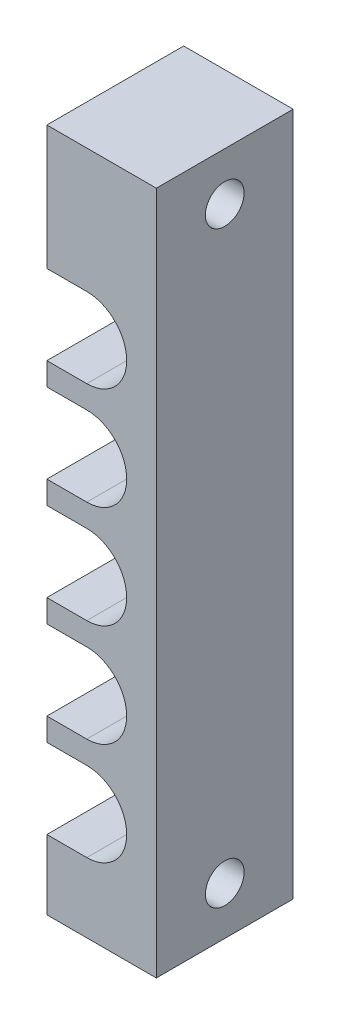
ISO-10303-21;
HEADER;
FILE_DESCRIPTION(('STEP AP214'),'2;1');
FILE_NAME('part.step','',(''),(''),'','','');
FILE_SCHEMA(('AUTOMOTIVE_DESIGN { 1 0 10303 214 1 1 1 1 }'));
ENDSEC;
DATA;
#1=APPLICATION_CONTEXT('core data for automotive mechanical design processes');
#2=APPLICATION_PROTOCOL_DEFINITION('international standard','automotive_design',2000,#1);
#3=PRODUCT_CONTEXT('',#1,'mechanical');
#4=PRODUCT('Part','Part','',(#3));
#5=PRODUCT_RELATED_PRODUCT_CATEGORY('part','',(#4));
#6=PRODUCT_DEFINITION_FORMATION('','',#4);
#7=PRODUCT_DEFINITION_CONTEXT('part definition',#1,'design');
#8=PRODUCT_DEFINITION('design','',#6,#7);
#9=PRODUCT_DEFINITION_SHAPE('','',#8);
#10=(LENGTH_UNIT() NAMED_UNIT(*) SI_UNIT(.MILLI.,.METRE.));
#11=(NAMED_UNIT(*) PLANE_ANGLE_UNIT() SI_UNIT($,.RADIAN.));
#12=(NAMED_UNIT(*) SI_UNIT($,.STERADIAN.) SOLID_ANGLE_UNIT());
#13=UNCERTAINTY_MEASURE_WITH_UNIT(LENGTH_MEASURE(1.E-05),#10,'distance_accuracy_value','');
#14=(GEOMETRIC_REPRESENTATION_CONTEXT(3) GLOBAL_UNCERTAINTY_ASSIGNED_CONTEXT((#13)) GLOBAL_UNIT_ASSIGNED_CONTEXT((#10,
#11,#12)) REPRESENTATION_CONTEXT('',''));
#15=CARTESIAN_POINT('',(0.,0.,0.));
#16=DIRECTION('',(0.,0.,1.));
#17=DIRECTION('',(1.,0.,0.));
#18=AXIS2_PLACEMENT_3D('',#15,#16,#17);
#19=CARTESIAN_POINT('',(-40.8,2.4,-69.6));
#20=DIRECTION('',(0.,0.,1.));
#21=DIRECTION('',(1.,0.,0.));
#22=AXIS2_PLACEMENT_3D('',#19,#20,#21);
#23=PLANE('',#22);
#24=DIRECTION('',(1.,0.,0.));
#25=VECTOR('',#24,1.);
#26=CARTESIAN_POINT('',(-40.8,62.4,-69.6));
#27=LINE('',#26,#25);
#28=CARTESIAN_POINT('',(-31.2,62.4,-69.6));
#29=VERTEX_POINT('',#28);
#30=CARTESIAN_POINT('',(-21.6,62.4,-69.6));
#31=VERTEX_POINT('',#30);
#32=EDGE_CURVE('E206',#29,#31,#27,.T.);
#33=ORIENTED_EDGE('',*,*,#32,.F.);
#34=DIRECTION('',(0.,1.,0.));
#35=VECTOR('',#34,1.);
#36=CARTESIAN_POINT('',(-31.1999999999995,71.6478124814453,-69.6000000000001));
#37=LINE('',#36,#35);
#38=CARTESIAN_POINT('',(-31.1999999999995,51.5,-69.6000000000001));
#39=VERTEX_POINT('',#38);
#40=EDGE_CURVE('E218',#39,#29,#37,.T.);
#41=ORIENTED_EDGE('',*,*,#40,.F.);
#42=DIRECTION('',(-1.,0.,0.));
#43=VECTOR('',#42,1.);
#44=CARTESIAN_POINT('',(-40.8,51.5,-69.6));
#45=LINE('',#44,#43);
#46=CARTESIAN_POINT('',(-27.7,51.5,-69.6));
#47=VERTEX_POINT('',#46);
#48=EDGE_CURVE('E263',#47,#39,#45,.T.);
#49=ORIENTED_EDGE('',*,*,#48,.F.);
#50=CARTESIAN_POINT('',(-27.7,48.,-69.6));
#51=DIRECTION('',(0.,0.,1.));
#52=DIRECTION('',(1.,0.,0.));
#53=AXIS2_PLACEMENT_3D('',#50,#51,#52);
#54=CIRCLE('',#53,3.5);
#55=CARTESIAN_POINT('',(-27.7,44.5,-69.6));
#56=VERTEX_POINT('',#55);
#57=EDGE_CURVE('E261',#56,#47,#54,.T.);
#58=ORIENTED_EDGE('',*,*,#57,.F.);
#59=DIRECTION('',(1.,0.,0.));
#60=VECTOR('',#59,1.);
#61=CARTESIAN_POINT('',(-40.8,44.5,-69.6));
#62=LINE('',#61,#60);
#63=CARTESIAN_POINT('',(-31.1999999999995,44.5,-69.6));
#64=VERTEX_POINT('',#63);
#65=EDGE_CURVE('E255',#64,#56,#62,.T.);
#66=ORIENTED_EDGE('',*,*,#65,.F.);
#67=CARTESIAN_POINT('',(-31.1999999999995,42.5,-69.6000000000001));
#68=VERTEX_POINT('',#67);
#69=EDGE_CURVE('E373',#68,#64,#37,.T.);
#70=ORIENTED_EDGE('',*,*,#69,.F.);
#71=DIRECTION('',(-1.,0.,0.));
#72=VECTOR('',#71,1.);
#73=CARTESIAN_POINT('',(-40.8,42.5,-69.6));
#74=LINE('',#73,#72);
#75=CARTESIAN_POINT('',(-27.7,42.5,-69.6));
#76=VERTEX_POINT('',#75);
#77=EDGE_CURVE('E327',#76,#68,#74,.T.);
#78=ORIENTED_EDGE('',*,*,#77,.F.);
#79=CARTESIAN_POINT('',(-27.7,39.,-69.6));
#80=DIRECTION('',(0.,0.,1.));
#81=DIRECTION('',(1.,0.,0.));
#82=AXIS2_PLACEMENT_3D('',#79,#80,#81);
#83=CIRCLE('',#82,3.50000000000001);
#84=CARTESIAN_POINT('',(-27.7,35.5,-69.6));
#85=VERTEX_POINT('',#84);
#86=EDGE_CURVE('E325',#85,#76,#83,.T.);
#87=ORIENTED_EDGE('',*,*,#86,.F.);
#88=DIRECTION('',(1.,0.,0.));
#89=VECTOR('',#88,1.);
#90=CARTESIAN_POINT('',(-40.8,35.5,-69.6));
#91=LINE('',#90,#89);
#92=CARTESIAN_POINT('',(-31.1999999999995,35.5,-69.6000000000001));
#93=VERTEX_POINT('',#92);
#94=EDGE_CURVE('E319',#93,#85,#91,.T.);
#95=ORIENTED_EDGE('',*,*,#94,.F.);
#96=CARTESIAN_POINT('',(-31.1999999999995,33.5,-69.6000000000001));
#97=VERTEX_POINT('',#96);
#98=EDGE_CURVE('E432',#97,#93,#37,.T.);
#99=ORIENTED_EDGE('',*,*,#98,.F.);
#100=DIRECTION('',(-1.,0.,0.));
#101=VECTOR('',#100,1.);
#102=CARTESIAN_POINT('',(-40.8,33.5,-69.6));
#103=LINE('',#102,#101);
#104=CARTESIAN_POINT('',(-27.7,33.5,-69.6));
#105=VERTEX_POINT('',#104);
#106=EDGE_CURVE('E286',#105,#97,#103,.T.);
#107=ORIENTED_EDGE('',*,*,#106,.F.);
#108=CARTESIAN_POINT('',(-27.7,30.,-69.6));
#109=DIRECTION('',(0.,0.,1.));
#110=DIRECTION('',(1.,0.,0.));
#111=AXIS2_PLACEMENT_3D('',#108,#109,#110);
#112=CIRCLE('',#111,3.5);
#113=CARTESIAN_POINT('',(-27.7,26.5,-69.6));
#114=VERTEX_POINT('',#113);
#115=EDGE_CURVE('E284',#114,#105,#112,.T.);
#116=ORIENTED_EDGE('',*,*,#115,.F.);
#117=DIRECTION('',(1.,0.,0.));
#118=VECTOR('',#117,1.);
#119=CARTESIAN_POINT('',(-40.8,26.5,-69.6));
#120=LINE('',#119,#118);
#121=CARTESIAN_POINT('',(-31.1999999999995,26.5,-69.6));
#122=VERTEX_POINT('',#121);
#123=EDGE_CURVE('E278',#122,#114,#120,.T.);
#124=ORIENTED_EDGE('',*,*,#123,.F.);
#125=CARTESIAN_POINT('',(-31.1999999999995,24.5,-69.6000000000001));
#126=VERTEX_POINT('',#125);
#127=EDGE_CURVE('E52',#126,#122,#37,.T.);
#128=ORIENTED_EDGE('',*,*,#127,.F.);
#129=DIRECTION('',(-1.,0.,0.));
#130=VECTOR('',#129,1.);
#131=CARTESIAN_POINT('',(-40.8,24.5,-69.6));
#132=LINE('',#131,#130);
#133=CARTESIAN_POINT('',(-27.7,24.5,-69.6));
#134=VERTEX_POINT('',#133);
#135=EDGE_CURVE('E347',#134,#126,#132,.T.);
#136=ORIENTED_EDGE('',*,*,#135,.F.);
#137=CARTESIAN_POINT('',(-27.7,21.,-69.6));
#138=DIRECTION('',(0.,0.,1.));
#139=DIRECTION('',(1.,0.,0.));
#140=AXIS2_PLACEMENT_3D('',#137,#138,#139);
#141=CIRCLE('',#140,3.5);
#142=CARTESIAN_POINT('',(-27.7,17.5,-69.6));
#143=VERTEX_POINT('',#142);
#144=EDGE_CURVE('E294',#143,#134,#141,.T.);
#145=ORIENTED_EDGE('',*,*,#144,.F.);
#146=DIRECTION('',(1.,0.,0.));
#147=VECTOR('',#146,1.);
#148=CARTESIAN_POINT('',(-40.8,17.5,-69.6));
#149=LINE('',#148,#147);
#150=CARTESIAN_POINT('',(-31.1999999999995,17.5,-69.6000000000001));
#151=VERTEX_POINT('',#150);
#152=EDGE_CURVE('E340',#151,#143,#149,.T.);
#153=ORIENTED_EDGE('',*,*,#152,.F.);
#154=CARTESIAN_POINT('',(-31.1999999999995,15.5,-69.6000000000001));
#155=VERTEX_POINT('',#154);
#156=EDGE_CURVE('E216',#155,#151,#37,.T.);
#157=ORIENTED_EDGE('',*,*,#156,.F.);
#158=DIRECTION('',(-1.,0.,0.));
#159=VECTOR('',#158,1.);
#160=CARTESIAN_POINT('',(-40.8,15.5,-69.6));
#161=LINE('',#160,#159);
#162=CARTESIAN_POINT('',(-27.7,15.5,-69.6));
#163=VERTEX_POINT('',#162);
#164=EDGE_CURVE('E307',#163,#155,#161,.T.);
#165=ORIENTED_EDGE('',*,*,#164,.F.);
#166=CARTESIAN_POINT('',(-27.7,12.,-69.6));
#167=DIRECTION('',(0.,0.,1.));
#168=DIRECTION('',(1.,0.,0.));
#169=AXIS2_PLACEMENT_3D('',#166,#167,#168);
#170=CIRCLE('',#169,3.49999999999998);
#171=CARTESIAN_POINT('',(-27.7,8.49999999999999,-69.6));
#172=VERTEX_POINT('',#171);
#173=EDGE_CURVE('E235',#172,#163,#170,.T.);
#174=ORIENTED_EDGE('',*,*,#173,.F.);
#175=DIRECTION('',(1.,0.,0.));
#176=VECTOR('',#175,1.);
#177=CARTESIAN_POINT('',(-40.8,8.49999999999999,-69.6));
#178=LINE('',#177,#176);
#179=CARTESIAN_POINT('',(-31.1999999999995,8.49999999999999,-69.6000000000001));
#180=VERTEX_POINT('',#179);
#181=EDGE_CURVE('E215',#180,#172,#178,.T.);
#182=ORIENTED_EDGE('',*,*,#181,.F.);
#183=CARTESIAN_POINT('',(-31.1999999999995,2.4,-69.6000000000001));
#184=VERTEX_POINT('',#183);
#185=EDGE_CURVE('E199',#184,#180,#37,.T.);
#186=ORIENTED_EDGE('',*,*,#185,.F.);
#187=DIRECTION('',(1.,0.,0.));
#188=VECTOR('',#187,1.);
#189=CARTESIAN_POINT('',(-40.8,2.4,-69.6));
#190=LINE('',#189,#188);
#191=CARTESIAN_POINT('',(-21.6,2.4,-69.6));
#192=VERTEX_POINT('',#191);
#193=EDGE_CURVE('E212',#184,#192,#190,.T.);
#194=ORIENTED_EDGE('',*,*,#193,.T.);
#195=DIRECTION('',(0.,-1.,0.));
#196=VECTOR('',#195,1.);
#197=CARTESIAN_POINT('',(-21.6,2.4,-69.6));
#198=LINE('',#197,#196);
#199=EDGE_CURVE('E271',#31,#192,#198,.T.);
#200=ORIENTED_EDGE('',*,*,#199,.F.);
#201=EDGE_LOOP('',(#33,#41,#49,#58,#66,#70,#78,#87,#95,#99,#107,#116,#124,#128,#136,#145,#153,
#157,#165,#174,#182,#186,#194,#200));
#202=FACE_BOUND('',#201,.T.);
#203=ADVANCED_FACE('F36',(#202),#23,.T.);
#204=CARTESIAN_POINT('',(-40.8,2.4,-81.6));
#205=DIRECTION('',(0.,0.,-1.));
#206=DIRECTION('',(0.,1.,0.));
#207=AXIS2_PLACEMENT_3D('',#204,#205,#206);
#208=PLANE('',#207);
#209=DIRECTION('',(1.,0.,0.));
#210=VECTOR('',#209,1.);
#211=CARTESIAN_POINT('',(-40.8,2.4,-81.6));
#212=LINE('',#211,#210);
#213=CARTESIAN_POINT('',(-31.2,2.4,-81.6));
#214=VERTEX_POINT('',#213);
#215=CARTESIAN_POINT('',(-21.6,2.4,-81.6));
#216=VERTEX_POINT('',#215);
#217=EDGE_CURVE('E223',#214,#216,#212,.T.);
#218=ORIENTED_EDGE('',*,*,#217,.F.);
#219=DIRECTION('',(0.,1.,0.));
#220=VECTOR('',#219,1.);
#221=CARTESIAN_POINT('',(-31.1999999999994,2.4,-81.6));
#222=LINE('',#221,#220);
#223=CARTESIAN_POINT('',(-31.1999999999994,8.49999999999999,-81.6));
#224=VERTEX_POINT('',#223);
#225=EDGE_CURVE('E202',#214,#224,#222,.T.);
#226=ORIENTED_EDGE('',*,*,#225,.T.);
#227=DIRECTION('',(1.,0.,0.));
#228=VECTOR('',#227,1.);
#229=CARTESIAN_POINT('',(-40.8,8.49999999999999,-81.6));
#230=LINE('',#229,#228);
#231=CARTESIAN_POINT('',(-27.7,8.49999999999999,-81.6));
#232=VERTEX_POINT('',#231);
#233=EDGE_CURVE('E303',#224,#232,#230,.T.);
#234=ORIENTED_EDGE('',*,*,#233,.T.);
#235=CARTESIAN_POINT('',(-27.7,12.,-81.6));
#236=DIRECTION('',(0.,0.,1.));
#237=DIRECTION('',(1.,0.,0.));
#238=AXIS2_PLACEMENT_3D('',#235,#236,#237);
#239=CIRCLE('',#238,3.49999999999998);
#240=CARTESIAN_POINT('',(-27.7,15.5,-81.6));
#241=VERTEX_POINT('',#240);
#242=EDGE_CURVE('E297',#232,#241,#239,.T.);
#243=ORIENTED_EDGE('',*,*,#242,.T.);
#244=DIRECTION('',(-1.,0.,0.));
#245=VECTOR('',#244,1.);
#246=CARTESIAN_POINT('',(-40.8,15.5,-81.6));
#247=LINE('',#246,#245);
#248=CARTESIAN_POINT('',(-31.1999999999995,15.5,-81.6));
#249=VERTEX_POINT('',#248);
#250=EDGE_CURVE('E300',#241,#249,#247,.T.);
#251=ORIENTED_EDGE('',*,*,#250,.T.);
#252=CARTESIAN_POINT('',(-31.1999999999994,17.5,-81.6));
#253=VERTEX_POINT('',#252);
#254=EDGE_CURVE('E397',#249,#253,#222,.T.);
#255=ORIENTED_EDGE('',*,*,#254,.T.);
#256=DIRECTION('',(1.,0.,0.));
#257=VECTOR('',#256,1.);
#258=CARTESIAN_POINT('',(-40.8,17.5,-81.6));
#259=LINE('',#258,#257);
#260=CARTESIAN_POINT('',(-27.7,17.5,-81.6));
#261=VERTEX_POINT('',#260);
#262=EDGE_CURVE('E343',#253,#261,#259,.T.);
#263=ORIENTED_EDGE('',*,*,#262,.T.);
#264=CARTESIAN_POINT('',(-27.7,21.,-81.6));
#265=DIRECTION('',(0.,0.,1.));
#266=DIRECTION('',(1.,0.,0.));
#267=AXIS2_PLACEMENT_3D('',#264,#265,#266);
#268=CIRCLE('',#267,3.5);
#269=CARTESIAN_POINT('',(-27.7,24.5,-81.6));
#270=VERTEX_POINT('',#269);
#271=EDGE_CURVE('E336',#261,#270,#268,.T.);
#272=ORIENTED_EDGE('',*,*,#271,.T.);
#273=DIRECTION('',(-1.,0.,0.));
#274=VECTOR('',#273,1.);
#275=CARTESIAN_POINT('',(-40.8,24.5,-81.6));
#276=LINE('',#275,#274);
#277=CARTESIAN_POINT('',(-31.1999999999994,24.5,-81.6));
#278=VERTEX_POINT('',#277);
#279=EDGE_CURVE('E339',#270,#278,#276,.T.);
#280=ORIENTED_EDGE('',*,*,#279,.T.);
#281=CARTESIAN_POINT('',(-31.1999999999994,26.5,-81.6));
#282=VERTEX_POINT('',#281);
#283=EDGE_CURVE('E241',#278,#282,#222,.T.);
#284=ORIENTED_EDGE('',*,*,#283,.T.);
#285=DIRECTION('',(1.,0.,0.));
#286=VECTOR('',#285,1.);
#287=CARTESIAN_POINT('',(-40.8,26.5,-81.6));
#288=LINE('',#287,#286);
#289=CARTESIAN_POINT('',(-27.7,26.5,-81.6));
#290=VERTEX_POINT('',#289);
#291=EDGE_CURVE('E281',#282,#290,#288,.T.);
#292=ORIENTED_EDGE('',*,*,#291,.T.);
#293=CARTESIAN_POINT('',(-27.7,30.,-81.6));
#294=DIRECTION('',(0.,0.,1.));
#295=DIRECTION('',(1.,0.,0.));
#296=AXIS2_PLACEMENT_3D('',#293,#294,#295);
#297=CIRCLE('',#296,3.5);
#298=CARTESIAN_POINT('',(-27.7,33.5,-81.6));
#299=VERTEX_POINT('',#298);
#300=EDGE_CURVE('E274',#290,#299,#297,.T.);
#301=ORIENTED_EDGE('',*,*,#300,.T.);
#302=DIRECTION('',(-1.,0.,0.));
#303=VECTOR('',#302,1.);
#304=CARTESIAN_POINT('',(-40.8,33.5,-81.6));
#305=LINE('',#304,#303);
#306=CARTESIAN_POINT('',(-31.1999999999995,33.5,-81.6));
#307=VERTEX_POINT('',#306);
#308=EDGE_CURVE('E277',#299,#307,#305,.T.);
#309=ORIENTED_EDGE('',*,*,#308,.T.);
#310=CARTESIAN_POINT('',(-31.1999999999994,35.5,-81.6));
#311=VERTEX_POINT('',#310);
#312=EDGE_CURVE('E60',#307,#311,#222,.T.);
#313=ORIENTED_EDGE('',*,*,#312,.T.);
#314=DIRECTION('',(1.,0.,0.));
#315=VECTOR('',#314,1.);
#316=CARTESIAN_POINT('',(-40.8,35.5,-81.6));
#317=LINE('',#316,#315);
#318=CARTESIAN_POINT('',(-27.7,35.5,-81.6));
#319=VERTEX_POINT('',#318);
#320=EDGE_CURVE('E322',#311,#319,#317,.T.);
#321=ORIENTED_EDGE('',*,*,#320,.T.);
#322=CARTESIAN_POINT('',(-27.7,39.,-81.6));
#323=DIRECTION('',(0.,0.,1.));
#324=DIRECTION('',(1.,0.,0.));
#325=AXIS2_PLACEMENT_3D('',#322,#323,#324);
#326=CIRCLE('',#325,3.50000000000001);
#327=CARTESIAN_POINT('',(-27.7,42.5,-81.6));
#328=VERTEX_POINT('',#327);
#329=EDGE_CURVE('E315',#319,#328,#326,.T.);
#330=ORIENTED_EDGE('',*,*,#329,.T.);
#331=DIRECTION('',(-1.,0.,0.));
#332=VECTOR('',#331,1.);
#333=CARTESIAN_POINT('',(-40.8,42.5,-81.6));
#334=LINE('',#333,#332);
#335=CARTESIAN_POINT('',(-31.1999999999994,42.5,-81.6));
#336=VERTEX_POINT('',#335);
#337=EDGE_CURVE('E318',#328,#336,#334,.T.);
#338=ORIENTED_EDGE('',*,*,#337,.T.);
#339=CARTESIAN_POINT('',(-31.1999999999994,44.5,-81.6));
#340=VERTEX_POINT('',#339);
#341=EDGE_CURVE('E393',#336,#340,#222,.T.);
#342=ORIENTED_EDGE('',*,*,#341,.T.);
#343=DIRECTION('',(1.,0.,0.));
#344=VECTOR('',#343,1.);
#345=CARTESIAN_POINT('',(-40.8,44.5,-81.6));
#346=LINE('',#345,#344);
#347=CARTESIAN_POINT('',(-27.7,44.5,-81.6));
#348=VERTEX_POINT('',#347);
#349=EDGE_CURVE('E258',#340,#348,#346,.T.);
#350=ORIENTED_EDGE('',*,*,#349,.T.);
#351=CARTESIAN_POINT('',(-27.7,48.,-81.6));
#352=DIRECTION('',(0.,0.,1.));
#353=DIRECTION('',(1.,0.,0.));
#354=AXIS2_PLACEMENT_3D('',#351,#352,#353);
#355=CIRCLE('',#354,3.5);
#356=CARTESIAN_POINT('',(-27.7,51.5,-81.6));
#357=VERTEX_POINT('',#356);
#358=EDGE_CURVE('E251',#348,#357,#355,.T.);
#359=ORIENTED_EDGE('',*,*,#358,.T.);
#360=DIRECTION('',(-1.,0.,0.));
#361=VECTOR('',#360,1.);
#362=CARTESIAN_POINT('',(-40.8,51.5,-81.6));
#363=LINE('',#362,#361);
#364=CARTESIAN_POINT('',(-31.1999999999994,51.5,-81.6));
#365=VERTEX_POINT('',#364);
#366=EDGE_CURVE('E254',#357,#365,#363,.T.);
#367=ORIENTED_EDGE('',*,*,#366,.T.);
#368=CARTESIAN_POINT('',(-31.1999999999995,62.4,-81.6));
#369=VERTEX_POINT('',#368);
#370=EDGE_CURVE('E247',#365,#369,#222,.T.);
#371=ORIENTED_EDGE('',*,*,#370,.T.);
#372=DIRECTION('',(1.,0.,0.));
#373=VECTOR('',#372,1.);
#374=CARTESIAN_POINT('',(-40.8,62.4,-81.6));
#375=LINE('',#374,#373);
#376=CARTESIAN_POINT('',(-21.6,62.4,-81.6));
#377=VERTEX_POINT('',#376);
#378=EDGE_CURVE('E226',#369,#377,#375,.T.);
#379=ORIENTED_EDGE('',*,*,#378,.T.);
#380=DIRECTION('',(0.,1.,0.));
#381=VECTOR('',#380,1.);
#382=CARTESIAN_POINT('',(-21.6,2.4,-81.6));
#383=LINE('',#382,#381);
#384=EDGE_CURVE('E229',#216,#377,#383,.T.);
#385=ORIENTED_EDGE('',*,*,#384,.F.);
#386=EDGE_LOOP('',(#218,#226,#234,#243,#251,#255,#263,#272,#280,#284,#292,#301,#309,#313,#321,
#330,#338,#342,#350,#359,#367,#371,#379,#385));
#387=FACE_BOUND('',#386,.T.);
#388=ADVANCED_FACE('F363',(#387),#208,.T.);
#389=CARTESIAN_POINT('',(-40.8,35.5,-81.6));
#390=DIRECTION('',(0.,-1.,0.));
#391=DIRECTION('',(0.,0.,-1.));
#392=AXIS2_PLACEMENT_3D('',#389,#390,#391);
#393=PLANE('',#392);
#394=DIRECTION('',(0.,0.,-1.));
#395=VECTOR('',#394,1.);
#396=CARTESIAN_POINT('',(-31.1999999999994,35.5,-81.5999999999999));
#397=LINE('',#396,#395);
#398=EDGE_CURVE('E407',#93,#311,#397,.T.);
#399=ORIENTED_EDGE('',*,*,#398,.F.);
#400=ORIENTED_EDGE('',*,*,#94,.T.);
#401=DIRECTION('',(0.,0.,1.));
#402=VECTOR('',#401,1.);
#403=CARTESIAN_POINT('',(-27.7,35.5,-81.6));
#404=LINE('',#403,#402);
#405=EDGE_CURVE('E264',#319,#85,#404,.T.);
#406=ORIENTED_EDGE('',*,*,#405,.F.);
#407=ORIENTED_EDGE('',*,*,#320,.F.);
#408=EDGE_LOOP('',(#399,#400,#406,#407));
#409=FACE_BOUND('',#408,.T.);
#410=ADVANCED_FACE('F459',(#409),#393,.F.);
#411=CARTESIAN_POINT('',(-40.8,42.5,-81.6));
#412=DIRECTION('',(0.,1.,0.));
#413=DIRECTION('',(0.,0.,1.));
#414=AXIS2_PLACEMENT_3D('',#411,#412,#413);
#415=PLANE('',#414);
#416=DIRECTION('',(0.,0.,1.));
#417=VECTOR('',#416,1.);
#418=CARTESIAN_POINT('',(-31.1999999999994,42.5,-81.5999999999999));
#419=LINE('',#418,#417);
#420=EDGE_CURVE('E396',#336,#68,#419,.T.);
#421=ORIENTED_EDGE('',*,*,#420,.F.);
#422=ORIENTED_EDGE('',*,*,#337,.F.);
#423=DIRECTION('',(0.,0.,1.));
#424=VECTOR('',#423,1.);
#425=CARTESIAN_POINT('',(-27.7,42.5,-81.6));
#426=LINE('',#425,#424);
#427=EDGE_CURVE('E324',#328,#76,#426,.T.);
#428=ORIENTED_EDGE('',*,*,#427,.T.);
#429=ORIENTED_EDGE('',*,*,#77,.T.);
#430=EDGE_LOOP('',(#421,#422,#428,#429));
#431=FACE_BOUND('',#430,.T.);
#432=ADVANCED_FACE('F464',(#431),#415,.F.);
#433=CARTESIAN_POINT('',(-40.8,17.5,-81.6));
#434=DIRECTION('',(0.,-1.,0.));
#435=DIRECTION('',(0.,0.,-1.));
#436=AXIS2_PLACEMENT_3D('',#433,#434,#435);
#437=PLANE('',#436);
#438=DIRECTION('',(0.,0.,-1.));
#439=VECTOR('',#438,1.);
#440=CARTESIAN_POINT('',(-31.1999999999994,17.5,-81.5999999999999));
#441=LINE('',#440,#439);
#442=EDGE_CURVE('E404',#151,#253,#441,.T.);
#443=ORIENTED_EDGE('',*,*,#442,.F.);
#444=ORIENTED_EDGE('',*,*,#152,.T.);
#445=DIRECTION('',(0.,0.,1.));
#446=VECTOR('',#445,1.);
#447=CARTESIAN_POINT('',(-27.7,17.5,-81.6));
#448=LINE('',#447,#446);
#449=EDGE_CURVE('E328',#261,#143,#448,.T.);
#450=ORIENTED_EDGE('',*,*,#449,.F.);
#451=ORIENTED_EDGE('',*,*,#262,.F.);
#452=EDGE_LOOP('',(#443,#444,#450,#451));
#453=FACE_BOUND('',#452,.T.);
#454=ADVANCED_FACE('F419',(#453),#437,.F.);
#455=CARTESIAN_POINT('',(-40.8,24.5,-81.6));
#456=DIRECTION('',(0.,1.,0.));
#457=DIRECTION('',(0.,0.,1.));
#458=AXIS2_PLACEMENT_3D('',#455,#456,#457);
#459=PLANE('',#458);
#460=DIRECTION('',(0.,0.,1.));
#461=VECTOR('',#460,1.);
#462=CARTESIAN_POINT('',(-31.1999999999994,24.5,-81.5999999999999));
#463=LINE('',#462,#461);
#464=EDGE_CURVE('E238',#278,#126,#463,.T.);
#465=ORIENTED_EDGE('',*,*,#464,.F.);
#466=ORIENTED_EDGE('',*,*,#279,.F.);
#467=DIRECTION('',(0.,0.,1.));
#468=VECTOR('',#467,1.);
#469=CARTESIAN_POINT('',(-27.7,24.5,-81.6));
#470=LINE('',#469,#468);
#471=EDGE_CURVE('E345',#270,#134,#470,.T.);
#472=ORIENTED_EDGE('',*,*,#471,.T.);
#473=ORIENTED_EDGE('',*,*,#135,.T.);
#474=EDGE_LOOP('',(#465,#466,#472,#473));
#475=FACE_BOUND('',#474,.T.);
#476=ADVANCED_FACE('F428',(#475),#459,.F.);
#477=CARTESIAN_POINT('',(-40.8,26.5,-81.6));
#478=DIRECTION('',(0.,-1.,0.));
#479=DIRECTION('',(0.,0.,-1.));
#480=AXIS2_PLACEMENT_3D('',#477,#478,#479);
#481=PLANE('',#480);
#482=DIRECTION('',(0.,0.,-1.));
#483=VECTOR('',#482,1.);
#484=CARTESIAN_POINT('',(-31.1999999999994,26.5,-81.5999999999999));
#485=LINE('',#484,#483);
#486=EDGE_CURVE('E245',#122,#282,#485,.T.);
#487=ORIENTED_EDGE('',*,*,#486,.F.);
#488=ORIENTED_EDGE('',*,*,#123,.T.);
#489=DIRECTION('',(0.,0.,1.));
#490=VECTOR('',#489,1.);
#491=CARTESIAN_POINT('',(-27.7,26.5,-81.6));
#492=LINE('',#491,#490);
#493=EDGE_CURVE('E291',#290,#114,#492,.T.);
#494=ORIENTED_EDGE('',*,*,#493,.F.);
#495=ORIENTED_EDGE('',*,*,#291,.F.);
#496=EDGE_LOOP('',(#487,#488,#494,#495));
#497=FACE_BOUND('',#496,.T.);
#498=ADVANCED_FACE('F485',(#497),#481,.F.);
#499=CARTESIAN_POINT('',(-40.8,33.5,-81.6));
#500=DIRECTION('',(0.,1.,0.));
#501=DIRECTION('',(0.,0.,1.));
#502=AXIS2_PLACEMENT_3D('',#499,#500,#501);
#503=PLANE('',#502);
#504=DIRECTION('',(0.,0.,1.));
#505=VECTOR('',#504,1.);
#506=CARTESIAN_POINT('',(-31.1999999999994,33.5,-81.5999999999999));
#507=LINE('',#506,#505);
#508=EDGE_CURVE('E406',#307,#97,#507,.T.);
#509=ORIENTED_EDGE('',*,*,#508,.F.);
#510=ORIENTED_EDGE('',*,*,#308,.F.);
#511=DIRECTION('',(0.,0.,1.));
#512=VECTOR('',#511,1.);
#513=CARTESIAN_POINT('',(-27.7,33.5,-81.6));
#514=LINE('',#513,#512);
#515=EDGE_CURVE('E283',#299,#105,#514,.T.);
#516=ORIENTED_EDGE('',*,*,#515,.T.);
#517=ORIENTED_EDGE('',*,*,#106,.T.);
#518=EDGE_LOOP('',(#509,#510,#516,#517));
#519=FACE_BOUND('',#518,.T.);
#520=ADVANCED_FACE('F502',(#519),#503,.F.);
#521=CARTESIAN_POINT('',(-40.8,8.49999999999999,-81.6));
#522=DIRECTION('',(0.,-1.,0.));
#523=DIRECTION('',(0.,0.,-1.));
#524=AXIS2_PLACEMENT_3D('',#521,#522,#523);
#525=PLANE('',#524);
#526=DIRECTION('',(0.,0.,-1.));
#527=VECTOR('',#526,1.);
#528=CARTESIAN_POINT('',(-31.1999999999994,8.49999999999999,-81.5999999999999));
#529=LINE('',#528,#527);
#530=EDGE_CURVE('E394',#180,#224,#529,.T.);
#531=ORIENTED_EDGE('',*,*,#530,.F.);
#532=ORIENTED_EDGE('',*,*,#181,.T.);
#533=DIRECTION('',(0.,0.,1.));
#534=VECTOR('',#533,1.);
#535=CARTESIAN_POINT('',(-27.7,8.49999999999999,-81.6));
#536=LINE('',#535,#534);
#537=EDGE_CURVE('E287',#232,#172,#536,.T.);
#538=ORIENTED_EDGE('',*,*,#537,.F.);
#539=ORIENTED_EDGE('',*,*,#233,.F.);
#540=EDGE_LOOP('',(#531,#532,#538,#539));
#541=FACE_BOUND('',#540,.T.);
#542=ADVANCED_FACE('F498',(#541),#525,.F.);
#543=CARTESIAN_POINT('',(-40.8,15.5,-81.6));
#544=DIRECTION('',(0.,1.,0.));
#545=DIRECTION('',(0.,0.,1.));
#546=AXIS2_PLACEMENT_3D('',#543,#544,#545);
#547=PLANE('',#546);
#548=DIRECTION('',(0.,0.,1.));
#549=VECTOR('',#548,1.);
#550=CARTESIAN_POINT('',(-31.1999999999994,15.5,-81.5999999999999));
#551=LINE('',#550,#549);
#552=EDGE_CURVE('E402',#249,#155,#551,.T.);
#553=ORIENTED_EDGE('',*,*,#552,.F.);
#554=ORIENTED_EDGE('',*,*,#250,.F.);
#555=DIRECTION('',(0.,0.,1.));
#556=VECTOR('',#555,1.);
#557=CARTESIAN_POINT('',(-27.7,15.5,-81.6));
#558=LINE('',#557,#556);
#559=EDGE_CURVE('E305',#241,#163,#558,.T.);
#560=ORIENTED_EDGE('',*,*,#559,.T.);
#561=ORIENTED_EDGE('',*,*,#164,.T.);
#562=EDGE_LOOP('',(#553,#554,#560,#561));
#563=FACE_BOUND('',#562,.T.);
#564=ADVANCED_FACE('F495',(#563),#547,.F.);
#565=CARTESIAN_POINT('',(-40.8,44.5,-81.6));
#566=DIRECTION('',(0.,-1.,0.));
#567=DIRECTION('',(0.,0.,-1.));
#568=AXIS2_PLACEMENT_3D('',#565,#566,#567);
#569=PLANE('',#568);
#570=DIRECTION('',(0.,0.,-1.));
#571=VECTOR('',#570,1.);
#572=CARTESIAN_POINT('',(-31.1999999999994,44.5,-81.5999999999999));
#573=LINE('',#572,#571);
#574=EDGE_CURVE('E390',#64,#340,#573,.T.);
#575=ORIENTED_EDGE('',*,*,#574,.F.);
#576=ORIENTED_EDGE('',*,*,#65,.T.);
#577=DIRECTION('',(0.,0.,1.));
#578=VECTOR('',#577,1.);
#579=CARTESIAN_POINT('',(-27.7,44.5,-81.6));
#580=LINE('',#579,#578);
#581=EDGE_CURVE('E268',#348,#56,#580,.T.);
#582=ORIENTED_EDGE('',*,*,#581,.F.);
#583=ORIENTED_EDGE('',*,*,#349,.F.);
#584=EDGE_LOOP('',(#575,#576,#582,#583));
#585=FACE_BOUND('',#584,.T.);
#586=ADVANCED_FACE('F388',(#585),#569,.F.);
#587=CARTESIAN_POINT('',(-40.8,51.5,-81.6));
#588=DIRECTION('',(0.,1.,0.));
#589=DIRECTION('',(0.,0.,1.));
#590=AXIS2_PLACEMENT_3D('',#587,#588,#589);
#591=PLANE('',#590);
#592=DIRECTION('',(0.,0.,1.));
#593=VECTOR('',#592,1.);
#594=CARTESIAN_POINT('',(-31.1999999999994,51.5,-81.5999999999999));
#595=LINE('',#594,#593);
#596=EDGE_CURVE('E378',#365,#39,#595,.T.);
#597=ORIENTED_EDGE('',*,*,#596,.F.);
#598=ORIENTED_EDGE('',*,*,#366,.F.);
#599=DIRECTION('',(0.,0.,1.));
#600=VECTOR('',#599,1.);
#601=CARTESIAN_POINT('',(-27.7,51.5,-81.6));
#602=LINE('',#601,#600);
#603=EDGE_CURVE('E260',#357,#47,#602,.T.);
#604=ORIENTED_EDGE('',*,*,#603,.T.);
#605=ORIENTED_EDGE('',*,*,#48,.T.);
#606=EDGE_LOOP('',(#597,#598,#604,#605));
#607=FACE_BOUND('',#606,.T.);
#608=ADVANCED_FACE('F376',(#607),#591,.F.);
#609=CARTESIAN_POINT('',(-40.8,6.60000000000001,-75.6));
#610=DIRECTION('',(-1.,0.,0.));
#611=DIRECTION('',(0.,0.,1.));
#612=AXIS2_PLACEMENT_3D('',#609,#610,#611);
#613=CYLINDRICAL_SURFACE('',#612,1.69999999999999);
#614=CARTESIAN_POINT('',(-21.6,6.60000000000001,-75.6));
#615=DIRECTION('',(-1.,0.,0.));
#616=DIRECTION('',(0.,0.,1.));
#617=AXIS2_PLACEMENT_3D('',#614,#615,#616);
#618=CIRCLE('',#617,1.69999999999999);
#619=CARTESIAN_POINT('',(-21.6,6.60000000000001,-73.9));
#620=VERTEX_POINT('',#619);
#621=EDGE_CURVE('E233',#620,#620,#618,.T.);
#622=ORIENTED_EDGE('',*,*,#621,.F.);
#623=EDGE_LOOP('',(#622));
#624=FACE_BOUND('',#623,.T.);
#625=CARTESIAN_POINT('',(-31.1999999999995,6.60000000000001,-75.6));
#626=DIRECTION('',(-1.,0.,0.));
#627=DIRECTION('',(0.,0.,1.));
#628=AXIS2_PLACEMENT_3D('',#625,#626,#627);
#629=CIRCLE('',#628,1.69999999999999);
#630=CARTESIAN_POINT('',(-31.1999999999995,6.60000000000001,-73.9));
#631=VERTEX_POINT('',#630);
#632=EDGE_CURVE('E433',#631,#631,#629,.F.);
#633=ORIENTED_EDGE('',*,*,#632,.F.);
#634=EDGE_LOOP('',(#633));
#635=FACE_BOUND('',#634,.T.);
#636=ADVANCED_FACE('F444',(#624,#635),#613,.F.);
#637=CARTESIAN_POINT('',(-40.8,58.2,-75.6));
#638=DIRECTION('',(-1.,0.,0.));
#639=DIRECTION('',(0.,0.,1.));
#640=AXIS2_PLACEMENT_3D('',#637,#638,#639);
#641=CYLINDRICAL_SURFACE('',#640,1.69999999999999);
#642=CARTESIAN_POINT('',(-21.6,58.2,-75.6));
#643=DIRECTION('',(-1.,0.,0.));
#644=DIRECTION('',(0.,0.,1.));
#645=AXIS2_PLACEMENT_3D('',#642,#643,#644);
#646=CIRCLE('',#645,1.69999999999999);
#647=CARTESIAN_POINT('',(-21.6,58.2,-73.9));
#648=VERTEX_POINT('',#647);
#649=EDGE_CURVE('E236',#648,#648,#646,.T.);
#650=ORIENTED_EDGE('',*,*,#649,.F.);
#651=EDGE_LOOP('',(#650));
#652=FACE_BOUND('',#651,.T.);
#653=CARTESIAN_POINT('',(-31.1999999999995,58.2,-75.6));
#654=DIRECTION('',(-1.,0.,0.));
#655=DIRECTION('',(0.,0.,1.));
#656=AXIS2_PLACEMENT_3D('',#653,#654,#655);
#657=CIRCLE('',#656,1.69999999999999);
#658=CARTESIAN_POINT('',(-31.1999999999995,58.2,-73.9));
#659=VERTEX_POINT('',#658);
#660=EDGE_CURVE('E39',#659,#659,#657,.F.);
#661=ORIENTED_EDGE('',*,*,#660,.F.);
#662=EDGE_LOOP('',(#661));
#663=FACE_BOUND('',#662,.T.);
#664=ADVANCED_FACE('F442',(#652,#663),#641,.F.);
#665=CARTESIAN_POINT('',(-40.8,62.4,-69.6));
#666=DIRECTION('',(0.,1.,0.));
#667=DIRECTION('',(0.,0.,1.));
#668=AXIS2_PLACEMENT_3D('',#665,#666,#667);
#669=PLANE('',#668);
#670=ORIENTED_EDGE('',*,*,#378,.F.);
#671=DIRECTION('',(0.,0.,1.));
#672=VECTOR('',#671,1.);
#673=CARTESIAN_POINT('',(-31.2,62.4,-69.6));
#674=LINE('',#673,#672);
#675=EDGE_CURVE('E11',#369,#29,#674,.T.);
#676=ORIENTED_EDGE('',*,*,#675,.T.);
#677=ORIENTED_EDGE('',*,*,#32,.T.);
#678=DIRECTION('',(0.,0.,1.));
#679=VECTOR('',#678,1.);
#680=CARTESIAN_POINT('',(-21.6,62.4,-69.6));
#681=LINE('',#680,#679);
#682=EDGE_CURVE('E224',#377,#31,#681,.T.);
#683=ORIENTED_EDGE('',*,*,#682,.F.);
#684=EDGE_LOOP('',(#670,#676,#677,#683));
#685=FACE_BOUND('',#684,.T.);
#686=ADVANCED_FACE('F368',(#685),#669,.T.);
#687=CARTESIAN_POINT('',(-40.8,2.4,-69.6));
#688=DIRECTION('',(0.,-1.,0.));
#689=DIRECTION('',(0.,0.,-1.));
#690=AXIS2_PLACEMENT_3D('',#687,#688,#689);
#691=PLANE('',#690);
#692=ORIENTED_EDGE('',*,*,#193,.F.);
#693=DIRECTION('',(0.,0.,-1.));
#694=VECTOR('',#693,1.);
#695=CARTESIAN_POINT('',(-31.2,2.4,-69.6));
#696=LINE('',#695,#694);
#697=EDGE_CURVE('E44',#184,#214,#696,.T.);
#698=ORIENTED_EDGE('',*,*,#697,.T.);
#699=ORIENTED_EDGE('',*,*,#217,.T.);
#700=DIRECTION('',(0.,0.,-1.));
#701=VECTOR('',#700,1.);
#702=CARTESIAN_POINT('',(-21.6,2.4,-69.6));
#703=LINE('',#702,#701);
#704=EDGE_CURVE('E221',#192,#216,#703,.T.);
#705=ORIENTED_EDGE('',*,*,#704,.F.);
#706=EDGE_LOOP('',(#692,#698,#699,#705));
#707=FACE_BOUND('',#706,.T.);
#708=ADVANCED_FACE('F219',(#707),#691,.T.);
#709=CARTESIAN_POINT('',(-21.6,0.,0.));
#710=DIRECTION('',(-1.,0.,0.));
#711=DIRECTION('',(0.,0.,1.));
#712=AXIS2_PLACEMENT_3D('',#709,#710,#711);
#713=PLANE('',#712);
#714=ORIENTED_EDGE('',*,*,#649,.T.);
#715=EDGE_LOOP('',(#714));
#716=FACE_BOUND('',#715,.T.);
#717=ORIENTED_EDGE('',*,*,#621,.T.);
#718=EDGE_LOOP('',(#717));
#719=FACE_BOUND('',#718,.T.);
#720=ORIENTED_EDGE('',*,*,#199,.T.);
#721=ORIENTED_EDGE('',*,*,#704,.T.);
#722=ORIENTED_EDGE('',*,*,#384,.T.);
#723=ORIENTED_EDGE('',*,*,#682,.T.);
#724=EDGE_LOOP('',(#720,#721,#722,#723));
#725=FACE_BOUND('',#724,.T.);
#726=ADVANCED_FACE('F367',(#716,#719,#725),#713,.F.);
#727=CARTESIAN_POINT('',(-27.7,39.,-81.6));
#728=DIRECTION('',(0.,0.,1.));
#729=DIRECTION('',(1.,0.,0.));
#730=AXIS2_PLACEMENT_3D('',#727,#728,#729);
#731=CYLINDRICAL_SURFACE('',#730,3.50000000000001);
#732=ORIENTED_EDGE('',*,*,#86,.T.);
#733=ORIENTED_EDGE('',*,*,#427,.F.);
#734=ORIENTED_EDGE('',*,*,#329,.F.);
#735=ORIENTED_EDGE('',*,*,#405,.T.);
#736=EDGE_LOOP('',(#732,#733,#734,#735));
#737=FACE_BOUND('',#736,.T.);
#738=ADVANCED_FACE('F472',(#737),#731,.F.);
#739=CARTESIAN_POINT('',(-27.7,21.,-81.6));
#740=DIRECTION('',(0.,0.,1.));
#741=DIRECTION('',(1.,0.,0.));
#742=AXIS2_PLACEMENT_3D('',#739,#740,#741);
#743=CYLINDRICAL_SURFACE('',#742,3.5);
#744=ORIENTED_EDGE('',*,*,#144,.T.);
#745=ORIENTED_EDGE('',*,*,#471,.F.);
#746=ORIENTED_EDGE('',*,*,#271,.F.);
#747=ORIENTED_EDGE('',*,*,#449,.T.);
#748=EDGE_LOOP('',(#744,#745,#746,#747));
#749=FACE_BOUND('',#748,.T.);
#750=ADVANCED_FACE('F424',(#749),#743,.F.);
#751=CARTESIAN_POINT('',(-27.7,30.,-81.6));
#752=DIRECTION('',(0.,0.,1.));
#753=DIRECTION('',(1.,0.,0.));
#754=AXIS2_PLACEMENT_3D('',#751,#752,#753);
#755=CYLINDRICAL_SURFACE('',#754,3.5);
#756=ORIENTED_EDGE('',*,*,#115,.T.);
#757=ORIENTED_EDGE('',*,*,#515,.F.);
#758=ORIENTED_EDGE('',*,*,#300,.F.);
#759=ORIENTED_EDGE('',*,*,#493,.T.);
#760=EDGE_LOOP('',(#756,#757,#758,#759));
#761=FACE_BOUND('',#760,.T.);
#762=ADVANCED_FACE('F482',(#761),#755,.F.);
#763=CARTESIAN_POINT('',(-27.7,12.,-81.6));
#764=DIRECTION('',(0.,0.,1.));
#765=DIRECTION('',(1.,0.,0.));
#766=AXIS2_PLACEMENT_3D('',#763,#764,#765);
#767=CYLINDRICAL_SURFACE('',#766,3.49999999999998);
#768=ORIENTED_EDGE('',*,*,#173,.T.);
#769=ORIENTED_EDGE('',*,*,#559,.F.);
#770=ORIENTED_EDGE('',*,*,#242,.F.);
#771=ORIENTED_EDGE('',*,*,#537,.T.);
#772=EDGE_LOOP('',(#768,#769,#770,#771));
#773=FACE_BOUND('',#772,.T.);
#774=ADVANCED_FACE('F491',(#773),#767,.F.);
#775=CARTESIAN_POINT('',(-27.7,48.,-81.6));
#776=DIRECTION('',(0.,0.,1.));
#777=DIRECTION('',(1.,0.,0.));
#778=AXIS2_PLACEMENT_3D('',#775,#776,#777);
#779=CYLINDRICAL_SURFACE('',#778,3.5);
#780=ORIENTED_EDGE('',*,*,#57,.T.);
#781=ORIENTED_EDGE('',*,*,#603,.F.);
#782=ORIENTED_EDGE('',*,*,#358,.F.);
#783=ORIENTED_EDGE('',*,*,#581,.T.);
#784=EDGE_LOOP('',(#780,#781,#782,#783));
#785=FACE_BOUND('',#784,.T.);
#786=ADVANCED_FACE('F381',(#785),#779,.F.);
#787=CARTESIAN_POINT('',(-31.2,0.,-2.18221575777202E-13));
#788=DIRECTION('',(-1.,0.,0.));
#789=DIRECTION('',(0.,0.,1.));
#790=AXIS2_PLACEMENT_3D('',#787,#788,#789);
#791=PLANE('',#790);
#792=ORIENTED_EDGE('',*,*,#660,.T.);
#793=EDGE_LOOP('',(#792));
#794=FACE_BOUND('',#793,.T.);
#795=ORIENTED_EDGE('',*,*,#596,.T.);
#796=ORIENTED_EDGE('',*,*,#40,.T.);
#797=ORIENTED_EDGE('',*,*,#675,.F.);
#798=ORIENTED_EDGE('',*,*,#370,.F.);
#799=EDGE_LOOP('',(#795,#796,#797,#798));
#800=FACE_BOUND('',#799,.T.);
#801=ADVANCED_FACE('F440',(#794,#800),#791,.T.);
#802=ORIENTED_EDGE('',*,*,#632,.T.);
#803=EDGE_LOOP('',(#802));
#804=FACE_BOUND('',#803,.T.);
#805=ORIENTED_EDGE('',*,*,#530,.T.);
#806=ORIENTED_EDGE('',*,*,#225,.F.);
#807=ORIENTED_EDGE('',*,*,#697,.F.);
#808=ORIENTED_EDGE('',*,*,#185,.T.);
#809=EDGE_LOOP('',(#805,#806,#807,#808));
#810=FACE_BOUND('',#809,.T.);
#811=ADVANCED_FACE('F198',(#804,#810),#791,.T.);
#812=ORIENTED_EDGE('',*,*,#420,.T.);
#813=ORIENTED_EDGE('',*,*,#69,.T.);
#814=ORIENTED_EDGE('',*,*,#574,.T.);
#815=ORIENTED_EDGE('',*,*,#341,.F.);
#816=EDGE_LOOP('',(#812,#813,#814,#815));
#817=FACE_BOUND('',#816,.T.);
#818=ADVANCED_FACE('F595',(#817),#791,.T.);
#819=ORIENTED_EDGE('',*,*,#442,.T.);
#820=ORIENTED_EDGE('',*,*,#254,.F.);
#821=ORIENTED_EDGE('',*,*,#552,.T.);
#822=ORIENTED_EDGE('',*,*,#156,.T.);
#823=EDGE_LOOP('',(#819,#820,#821,#822));
#824=FACE_BOUND('',#823,.T.);
#825=ADVANCED_FACE('F603',(#824),#791,.T.);
#826=ORIENTED_EDGE('',*,*,#398,.T.);
#827=ORIENTED_EDGE('',*,*,#312,.F.);
#828=ORIENTED_EDGE('',*,*,#508,.T.);
#829=ORIENTED_EDGE('',*,*,#98,.T.);
#830=EDGE_LOOP('',(#826,#827,#828,#829));
#831=FACE_BOUND('',#830,.T.);
#832=ADVANCED_FACE('F611',(#831),#791,.T.);
#833=ORIENTED_EDGE('',*,*,#464,.T.);
#834=ORIENTED_EDGE('',*,*,#127,.T.);
#835=ORIENTED_EDGE('',*,*,#486,.T.);
#836=ORIENTED_EDGE('',*,*,#283,.F.);
#837=EDGE_LOOP('',(#833,#834,#835,#836));
#838=FACE_BOUND('',#837,.T.);
#839=ADVANCED_FACE('F587',(#838),#791,.T.);
#840=CLOSED_SHELL('',(#203,#388,#410,#432,#454,#476,#498,#520,#542,#564,#586,#608,#636,#664,
#686,#708,#726,#738,#750,#762,#774,#786,#801,#811,#818,#825,#832,#839));
#841=MANIFOLD_SOLID_BREP('B2',#840);
#842=ADVANCED_BREP_SHAPE_REPRESENTATION('',(#18,#841),#14);
#843=SHAPE_DEFINITION_REPRESENTATION(#9,#842);
ENDSEC;
END-ISO-10303-21;
